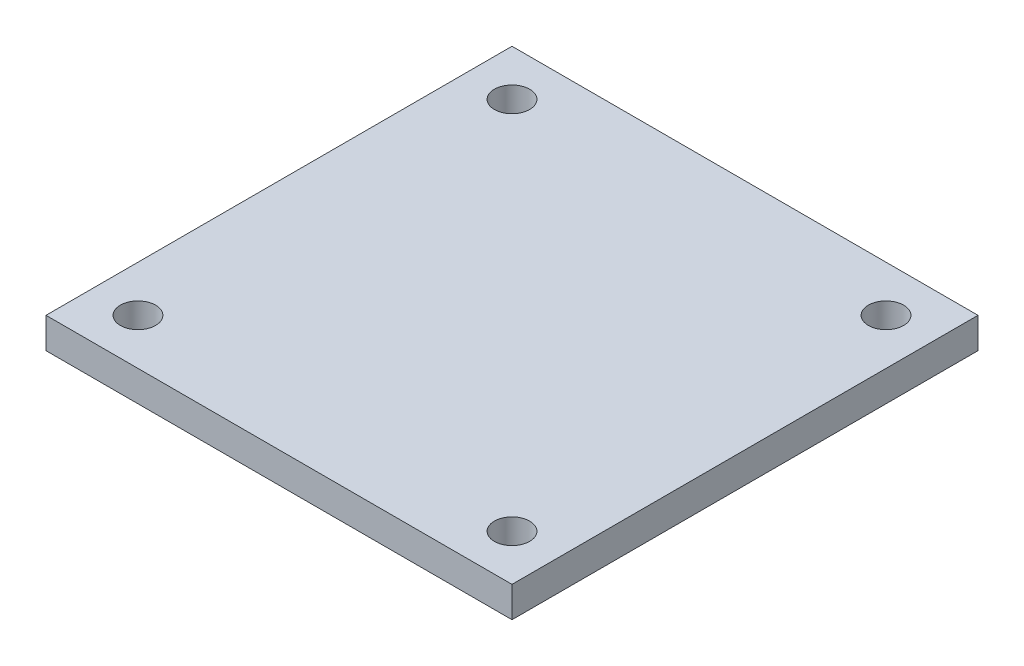
ISO-10303-21;
HEADER;
FILE_DESCRIPTION(('STEP AP214'),'2;1');
FILE_NAME('part.step','',(''),(''),'','','');
FILE_SCHEMA(('AUTOMOTIVE_DESIGN { 1 0 10303 214 1 1 1 1 }'));
ENDSEC;
DATA;
#1=APPLICATION_CONTEXT('core data for automotive mechanical design processes');
#2=APPLICATION_PROTOCOL_DEFINITION('international standard','automotive_design',2000,#1);
#3=PRODUCT_CONTEXT('',#1,'mechanical');
#4=PRODUCT('Part','Part','',(#3));
#5=PRODUCT_RELATED_PRODUCT_CATEGORY('part','',(#4));
#6=PRODUCT_DEFINITION_FORMATION('','',#4);
#7=PRODUCT_DEFINITION_CONTEXT('part definition',#1,'design');
#8=PRODUCT_DEFINITION('design','',#6,#7);
#9=PRODUCT_DEFINITION_SHAPE('','',#8);
#10=(LENGTH_UNIT() NAMED_UNIT(*) SI_UNIT(.MILLI.,.METRE.));
#11=(NAMED_UNIT(*) PLANE_ANGLE_UNIT() SI_UNIT($,.RADIAN.));
#12=(NAMED_UNIT(*) SI_UNIT($,.STERADIAN.) SOLID_ANGLE_UNIT());
#13=UNCERTAINTY_MEASURE_WITH_UNIT(LENGTH_MEASURE(1.E-05),#10,'distance_accuracy_value','');
#14=(GEOMETRIC_REPRESENTATION_CONTEXT(3) GLOBAL_UNCERTAINTY_ASSIGNED_CONTEXT((#13)) GLOBAL_UNIT_ASSIGNED_CONTEXT((#10,
#11,#12)) REPRESENTATION_CONTEXT('',''));
#15=CARTESIAN_POINT('',(0.,0.,0.));
#16=DIRECTION('',(0.,0.,1.));
#17=DIRECTION('',(1.,0.,0.));
#18=AXIS2_PLACEMENT_3D('',#15,#16,#17);
#19=CARTESIAN_POINT('',(0.,2.,0.));
#20=DIRECTION('',(0.,1.,0.));
#21=DIRECTION('',(0.,0.,1.));
#22=AXIS2_PLACEMENT_3D('',#19,#20,#21);
#23=PLANE('',#22);
#24=CARTESIAN_POINT('',(12.2,2.,12.2));
#25=DIRECTION('',(0.,1.,0.));
#26=DIRECTION('',(0.,0.,1.));
#27=AXIS2_PLACEMENT_3D('',#24,#25,#26);
#28=CIRCLE('',#27,1.15);
#29=CARTESIAN_POINT('',(12.2,2.,13.35));
#30=VERTEX_POINT('',#29);
#31=EDGE_CURVE('E130',#30,#30,#28,.T.);
#32=ORIENTED_EDGE('',*,*,#31,.F.);
#33=EDGE_LOOP('',(#32));
#34=FACE_BOUND('',#33,.T.);
#35=CARTESIAN_POINT('',(-12.2,2.,-12.2));
#36=DIRECTION('',(0.,1.,0.));
#37=DIRECTION('',(0.,0.,1.));
#38=AXIS2_PLACEMENT_3D('',#35,#36,#37);
#39=CIRCLE('',#38,1.15);
#40=CARTESIAN_POINT('',(-12.2,2.,-11.05));
#41=VERTEX_POINT('',#40);
#42=EDGE_CURVE('E106',#41,#41,#39,.T.);
#43=ORIENTED_EDGE('',*,*,#42,.F.);
#44=EDGE_LOOP('',(#43));
#45=FACE_BOUND('',#44,.T.);
#46=DIRECTION('',(0.,0.,-1.));
#47=VECTOR('',#46,1.);
#48=CARTESIAN_POINT('',(15.2,2.,-15.2));
#49=LINE('',#48,#47);
#50=CARTESIAN_POINT('',(15.2,2.,15.2));
#51=VERTEX_POINT('',#50);
#52=CARTESIAN_POINT('',(15.2,2.,-15.2));
#53=VERTEX_POINT('',#52);
#54=EDGE_CURVE('E93',#51,#53,#49,.T.);
#55=ORIENTED_EDGE('',*,*,#54,.T.);
#56=DIRECTION('',(-1.,0.,0.));
#57=VECTOR('',#56,1.);
#58=CARTESIAN_POINT('',(-15.2,2.,-15.2));
#59=LINE('',#58,#57);
#60=CARTESIAN_POINT('',(-15.2,2.,-15.2));
#61=VERTEX_POINT('',#60);
#62=EDGE_CURVE('E88',#53,#61,#59,.T.);
#63=ORIENTED_EDGE('',*,*,#62,.T.);
#64=DIRECTION('',(0.,0.,1.));
#65=VECTOR('',#64,1.);
#66=CARTESIAN_POINT('',(-15.2,2.,-15.2));
#67=LINE('',#66,#65);
#68=CARTESIAN_POINT('',(-15.2,2.,15.2));
#69=VERTEX_POINT('',#68);
#70=EDGE_CURVE('E90',#61,#69,#67,.T.);
#71=ORIENTED_EDGE('',*,*,#70,.T.);
#72=DIRECTION('',(1.,0.,0.));
#73=VECTOR('',#72,1.);
#74=CARTESIAN_POINT('',(-15.2,2.,15.2));
#75=LINE('',#74,#73);
#76=EDGE_CURVE('E57',#69,#51,#75,.T.);
#77=ORIENTED_EDGE('',*,*,#76,.T.);
#78=EDGE_LOOP('',(#55,#63,#71,#77));
#79=FACE_BOUND('',#78,.T.);
#80=CARTESIAN_POINT('',(12.2,2.,-12.2));
#81=DIRECTION('',(0.,1.,0.));
#82=DIRECTION('',(0.,0.,-1.));
#83=AXIS2_PLACEMENT_3D('',#80,#81,#82);
#84=CIRCLE('',#83,1.15);
#85=CARTESIAN_POINT('',(12.2,2.,-13.35));
#86=VERTEX_POINT('',#85);
#87=EDGE_CURVE('E121',#86,#86,#84,.T.);
#88=ORIENTED_EDGE('',*,*,#87,.F.);
#89=EDGE_LOOP('',(#88));
#90=FACE_BOUND('',#89,.T.);
#91=CARTESIAN_POINT('',(-12.2,2.,12.2));
#92=DIRECTION('',(0.,1.,0.));
#93=DIRECTION('',(0.,0.,-1.));
#94=AXIS2_PLACEMENT_3D('',#91,#92,#93);
#95=CIRCLE('',#94,1.15);
#96=CARTESIAN_POINT('',(-12.2,2.,11.05));
#97=VERTEX_POINT('',#96);
#98=EDGE_CURVE('E132',#97,#97,#95,.T.);
#99=ORIENTED_EDGE('',*,*,#98,.F.);
#100=EDGE_LOOP('',(#99));
#101=FACE_BOUND('',#100,.T.);
#102=ADVANCED_FACE('F39',(#34,#45,#79,#90,#101),#23,.T.);
#103=CARTESIAN_POINT('',(0.,0.,0.));
#104=DIRECTION('',(0.,1.,0.));
#105=DIRECTION('',(0.,0.,1.));
#106=AXIS2_PLACEMENT_3D('',#103,#104,#105);
#107=PLANE('',#106);
#108=DIRECTION('',(0.,0.,-1.));
#109=VECTOR('',#108,1.);
#110=CARTESIAN_POINT('',(15.2,0.,-15.2));
#111=LINE('',#110,#109);
#112=CARTESIAN_POINT('',(15.2,0.,15.2));
#113=VERTEX_POINT('',#112);
#114=CARTESIAN_POINT('',(15.2,0.,-15.2));
#115=VERTEX_POINT('',#114);
#116=EDGE_CURVE('E103',#113,#115,#111,.T.);
#117=ORIENTED_EDGE('',*,*,#116,.F.);
#118=DIRECTION('',(1.,0.,0.));
#119=VECTOR('',#118,1.);
#120=CARTESIAN_POINT('',(-15.2,0.,15.2));
#121=LINE('',#120,#119);
#122=CARTESIAN_POINT('',(-15.2,0.,15.2));
#123=VERTEX_POINT('',#122);
#124=EDGE_CURVE('E78',#123,#113,#121,.T.);
#125=ORIENTED_EDGE('',*,*,#124,.F.);
#126=DIRECTION('',(0.,0.,1.));
#127=VECTOR('',#126,1.);
#128=CARTESIAN_POINT('',(-15.2,0.,-15.2));
#129=LINE('',#128,#127);
#130=CARTESIAN_POINT('',(-15.2,0.,-15.2));
#131=VERTEX_POINT('',#130);
#132=EDGE_CURVE('E71',#131,#123,#129,.T.);
#133=ORIENTED_EDGE('',*,*,#132,.F.);
#134=DIRECTION('',(-1.,0.,0.));
#135=VECTOR('',#134,1.);
#136=CARTESIAN_POINT('',(-15.2,0.,-15.2));
#137=LINE('',#136,#135);
#138=EDGE_CURVE('E92',#115,#131,#137,.T.);
#139=ORIENTED_EDGE('',*,*,#138,.F.);
#140=EDGE_LOOP('',(#117,#125,#133,#139));
#141=FACE_BOUND('',#140,.T.);
#142=CARTESIAN_POINT('',(-12.2,0.,-12.2));
#143=DIRECTION('',(0.,1.,0.));
#144=DIRECTION('',(0.,0.,1.));
#145=AXIS2_PLACEMENT_3D('',#142,#143,#144);
#146=CIRCLE('',#145,1.15);
#147=CARTESIAN_POINT('',(-12.2,0.,-11.05));
#148=VERTEX_POINT('',#147);
#149=EDGE_CURVE('E117',#148,#148,#146,.T.);
#150=ORIENTED_EDGE('',*,*,#149,.T.);
#151=EDGE_LOOP('',(#150));
#152=FACE_BOUND('',#151,.T.);
#153=CARTESIAN_POINT('',(12.2,0.,-12.2));
#154=DIRECTION('',(0.,1.,0.));
#155=DIRECTION('',(0.,0.,-1.));
#156=AXIS2_PLACEMENT_3D('',#153,#154,#155);
#157=CIRCLE('',#156,1.15);
#158=CARTESIAN_POINT('',(12.2,0.,-13.35));
#159=VERTEX_POINT('',#158);
#160=EDGE_CURVE('E123',#159,#159,#157,.T.);
#161=ORIENTED_EDGE('',*,*,#160,.T.);
#162=EDGE_LOOP('',(#161));
#163=FACE_BOUND('',#162,.T.);
#164=CARTESIAN_POINT('',(12.2,0.,12.2));
#165=DIRECTION('',(0.,1.,0.));
#166=DIRECTION('',(0.,0.,1.));
#167=AXIS2_PLACEMENT_3D('',#164,#165,#166);
#168=CIRCLE('',#167,1.15);
#169=CARTESIAN_POINT('',(12.2,0.,13.35));
#170=VERTEX_POINT('',#169);
#171=EDGE_CURVE('E128',#170,#170,#168,.T.);
#172=ORIENTED_EDGE('',*,*,#171,.T.);
#173=EDGE_LOOP('',(#172));
#174=FACE_BOUND('',#173,.T.);
#175=CARTESIAN_POINT('',(-12.2,0.,12.2));
#176=DIRECTION('',(0.,1.,0.));
#177=DIRECTION('',(0.,0.,-1.));
#178=AXIS2_PLACEMENT_3D('',#175,#176,#177);
#179=CIRCLE('',#178,1.15);
#180=CARTESIAN_POINT('',(-12.2,0.,11.05));
#181=VERTEX_POINT('',#180);
#182=EDGE_CURVE('E136',#181,#181,#179,.T.);
#183=ORIENTED_EDGE('',*,*,#182,.T.);
#184=EDGE_LOOP('',(#183));
#185=FACE_BOUND('',#184,.T.);
#186=ADVANCED_FACE('F111',(#141,#152,#163,#174,#185),#107,.F.);
#187=CARTESIAN_POINT('',(15.2,2.,-15.2));
#188=DIRECTION('',(-1.,0.,0.));
#189=DIRECTION('',(0.,0.,1.));
#190=AXIS2_PLACEMENT_3D('',#187,#188,#189);
#191=PLANE('',#190);
#192=ORIENTED_EDGE('',*,*,#116,.T.);
#193=DIRECTION('',(0.,-1.,0.));
#194=VECTOR('',#193,1.);
#195=CARTESIAN_POINT('',(15.2,2.,-15.2));
#196=LINE('',#195,#194);
#197=EDGE_CURVE('E11',#53,#115,#196,.T.);
#198=ORIENTED_EDGE('',*,*,#197,.F.);
#199=ORIENTED_EDGE('',*,*,#54,.F.);
#200=DIRECTION('',(0.,-1.,0.));
#201=VECTOR('',#200,1.);
#202=CARTESIAN_POINT('',(15.2,2.,15.2));
#203=LINE('',#202,#201);
#204=EDGE_CURVE('E97',#51,#113,#203,.T.);
#205=ORIENTED_EDGE('',*,*,#204,.T.);
#206=EDGE_LOOP('',(#192,#198,#199,#205));
#207=FACE_BOUND('',#206,.T.);
#208=ADVANCED_FACE('F41',(#207),#191,.F.);
#209=CARTESIAN_POINT('',(-15.2,2.,-15.2));
#210=DIRECTION('',(0.,0.,1.));
#211=DIRECTION('',(1.,0.,0.));
#212=AXIS2_PLACEMENT_3D('',#209,#210,#211);
#213=PLANE('',#212);
#214=ORIENTED_EDGE('',*,*,#138,.T.);
#215=DIRECTION('',(0.,-1.,0.));
#216=VECTOR('',#215,1.);
#217=CARTESIAN_POINT('',(-15.2,2.,-15.2));
#218=LINE('',#217,#216);
#219=EDGE_CURVE('E48',#61,#131,#218,.T.);
#220=ORIENTED_EDGE('',*,*,#219,.F.);
#221=ORIENTED_EDGE('',*,*,#62,.F.);
#222=ORIENTED_EDGE('',*,*,#197,.T.);
#223=EDGE_LOOP('',(#214,#220,#221,#222));
#224=FACE_BOUND('',#223,.T.);
#225=ADVANCED_FACE('F94',(#224),#213,.F.);
#226=CARTESIAN_POINT('',(-15.2,2.,-15.2));
#227=DIRECTION('',(1.,0.,0.));
#228=DIRECTION('',(0.,0.,-1.));
#229=AXIS2_PLACEMENT_3D('',#226,#227,#228);
#230=PLANE('',#229);
#231=ORIENTED_EDGE('',*,*,#132,.T.);
#232=DIRECTION('',(0.,-1.,0.));
#233=VECTOR('',#232,1.);
#234=CARTESIAN_POINT('',(-15.2,2.,15.2));
#235=LINE('',#234,#233);
#236=EDGE_CURVE('E96',#69,#123,#235,.T.);
#237=ORIENTED_EDGE('',*,*,#236,.F.);
#238=ORIENTED_EDGE('',*,*,#70,.F.);
#239=ORIENTED_EDGE('',*,*,#219,.T.);
#240=EDGE_LOOP('',(#231,#237,#238,#239));
#241=FACE_BOUND('',#240,.T.);
#242=ADVANCED_FACE('F100',(#241),#230,.F.);
#243=CARTESIAN_POINT('',(-15.2,2.,15.2));
#244=DIRECTION('',(0.,0.,-1.));
#245=DIRECTION('',(-1.,0.,0.));
#246=AXIS2_PLACEMENT_3D('',#243,#244,#245);
#247=PLANE('',#246);
#248=ORIENTED_EDGE('',*,*,#124,.T.);
#249=ORIENTED_EDGE('',*,*,#204,.F.);
#250=ORIENTED_EDGE('',*,*,#76,.F.);
#251=ORIENTED_EDGE('',*,*,#236,.T.);
#252=EDGE_LOOP('',(#248,#249,#250,#251));
#253=FACE_BOUND('',#252,.T.);
#254=ADVANCED_FACE('F112',(#253),#247,.F.);
#255=CARTESIAN_POINT('',(-12.2,2.,-12.2));
#256=DIRECTION('',(0.,-1.,0.));
#257=DIRECTION('',(0.,0.,-1.));
#258=AXIS2_PLACEMENT_3D('',#255,#256,#257);
#259=CYLINDRICAL_SURFACE('',#258,1.15);
#260=ORIENTED_EDGE('',*,*,#42,.T.);
#261=EDGE_LOOP('',(#260));
#262=FACE_BOUND('',#261,.T.);
#263=ORIENTED_EDGE('',*,*,#149,.F.);
#264=EDGE_LOOP('',(#263));
#265=FACE_BOUND('',#264,.T.);
#266=ADVANCED_FACE('F154',(#262,#265),#259,.F.);
#267=CARTESIAN_POINT('',(12.2,2.,-12.2));
#268=DIRECTION('',(0.,-1.,0.));
#269=DIRECTION('',(0.,0.,-1.));
#270=AXIS2_PLACEMENT_3D('',#267,#268,#269);
#271=CYLINDRICAL_SURFACE('',#270,1.15);
#272=ORIENTED_EDGE('',*,*,#87,.T.);
#273=EDGE_LOOP('',(#272));
#274=FACE_BOUND('',#273,.T.);
#275=ORIENTED_EDGE('',*,*,#160,.F.);
#276=EDGE_LOOP('',(#275));
#277=FACE_BOUND('',#276,.T.);
#278=ADVANCED_FACE('F199',(#274,#277),#271,.F.);
#279=CARTESIAN_POINT('',(12.2,2.,12.2));
#280=DIRECTION('',(0.,-1.,0.));
#281=DIRECTION('',(0.,0.,-1.));
#282=AXIS2_PLACEMENT_3D('',#279,#280,#281);
#283=CYLINDRICAL_SURFACE('',#282,1.15);
#284=ORIENTED_EDGE('',*,*,#31,.T.);
#285=EDGE_LOOP('',(#284));
#286=FACE_BOUND('',#285,.T.);
#287=ORIENTED_EDGE('',*,*,#171,.F.);
#288=EDGE_LOOP('',(#287));
#289=FACE_BOUND('',#288,.T.);
#290=ADVANCED_FACE('F208',(#286,#289),#283,.F.);
#291=CARTESIAN_POINT('',(-12.2,2.,12.2));
#292=DIRECTION('',(0.,-1.,0.));
#293=DIRECTION('',(0.,0.,-1.));
#294=AXIS2_PLACEMENT_3D('',#291,#292,#293);
#295=CYLINDRICAL_SURFACE('',#294,1.15);
#296=ORIENTED_EDGE('',*,*,#98,.T.);
#297=EDGE_LOOP('',(#296));
#298=FACE_BOUND('',#297,.T.);
#299=ORIENTED_EDGE('',*,*,#182,.F.);
#300=EDGE_LOOP('',(#299));
#301=FACE_BOUND('',#300,.T.);
#302=ADVANCED_FACE('F142',(#298,#301),#295,.F.);
#303=CLOSED_SHELL('',(#102,#186,#208,#225,#242,#254,#266,#278,#290,#302));
#304=MANIFOLD_SOLID_BREP('B2',#303);
#305=ADVANCED_BREP_SHAPE_REPRESENTATION('',(#18,#304),#14);
#306=SHAPE_DEFINITION_REPRESENTATION(#9,#305);
ENDSEC;
END-ISO-10303-21;
